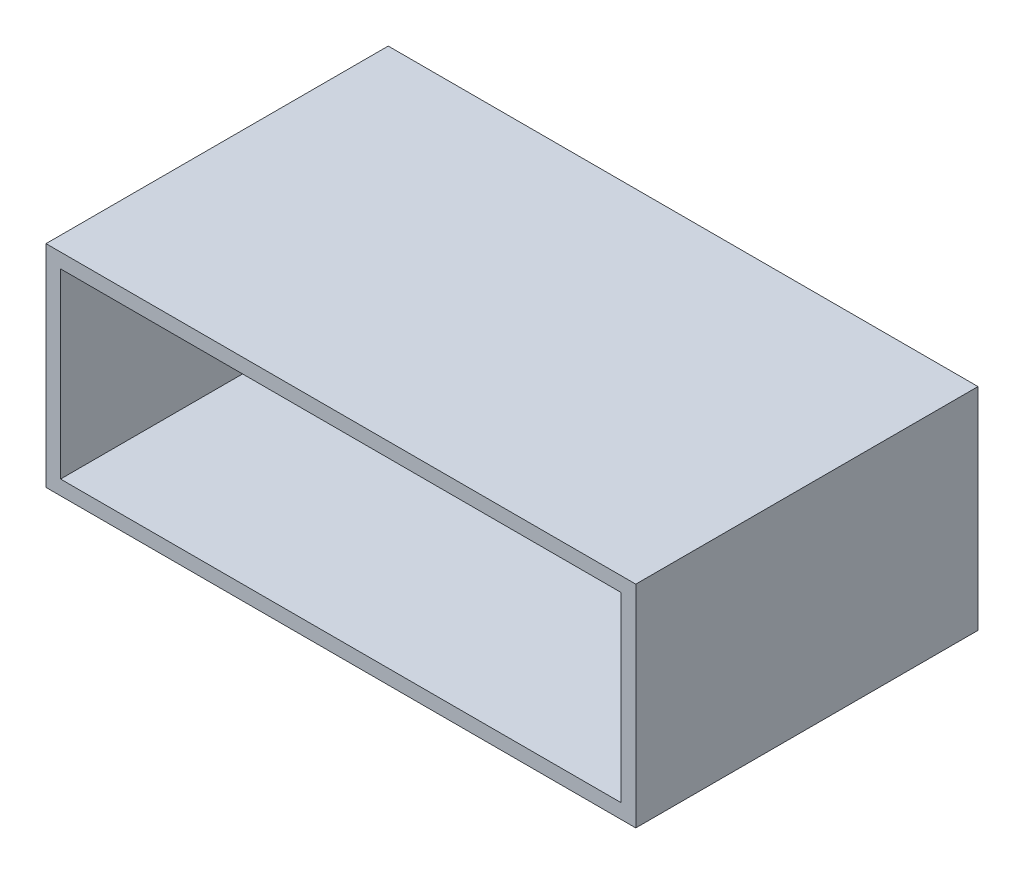
ISO-10303-21;
HEADER;
FILE_DESCRIPTION(('STEP AP214'),'2;1');
FILE_NAME('part.step','',(''),(''),'','','');
FILE_SCHEMA(('AUTOMOTIVE_DESIGN { 1 0 10303 214 1 1 1 1 }'));
ENDSEC;
DATA;
#1=APPLICATION_CONTEXT('core data for automotive mechanical design processes');
#2=APPLICATION_PROTOCOL_DEFINITION('international standard','automotive_design',2000,#1);
#3=PRODUCT_CONTEXT('',#1,'mechanical');
#4=PRODUCT('Part','Part','',(#3));
#5=PRODUCT_RELATED_PRODUCT_CATEGORY('part','',(#4));
#6=PRODUCT_DEFINITION_FORMATION('','',#4);
#7=PRODUCT_DEFINITION_CONTEXT('part definition',#1,'design');
#8=PRODUCT_DEFINITION('design','',#6,#7);
#9=PRODUCT_DEFINITION_SHAPE('','',#8);
#10=(LENGTH_UNIT() NAMED_UNIT(*) SI_UNIT(.MILLI.,.METRE.));
#11=(NAMED_UNIT(*) PLANE_ANGLE_UNIT() SI_UNIT($,.RADIAN.));
#12=(NAMED_UNIT(*) SI_UNIT($,.STERADIAN.) SOLID_ANGLE_UNIT());
#13=UNCERTAINTY_MEASURE_WITH_UNIT(LENGTH_MEASURE(1.E-05),#10,'distance_accuracy_value','');
#14=(GEOMETRIC_REPRESENTATION_CONTEXT(3) GLOBAL_UNCERTAINTY_ASSIGNED_CONTEXT((#13)) GLOBAL_UNIT_ASSIGNED_CONTEXT((#10,
#11,#12)) REPRESENTATION_CONTEXT('',''));
#15=CARTESIAN_POINT('',(0.,0.,0.));
#16=DIRECTION('',(0.,0.,1.));
#17=DIRECTION('',(1.,0.,0.));
#18=AXIS2_PLACEMENT_3D('',#15,#16,#17);
#19=CARTESIAN_POINT('',(0.,0.,47.));
#20=DIRECTION('',(0.,0.,-1.));
#21=DIRECTION('',(-1.,0.,0.));
#22=AXIS2_PLACEMENT_3D('',#19,#20,#21);
#23=PLANE('',#22);
#24=DIRECTION('',(0.,-1.,0.));
#25=VECTOR('',#24,1.);
#26=CARTESIAN_POINT('',(0.,0.,47.));
#27=LINE('',#26,#25);
#28=CARTESIAN_POINT('',(0.,29.,47.));
#29=VERTEX_POINT('',#28);
#30=CARTESIAN_POINT('',(0.,0.,47.));
#31=VERTEX_POINT('',#30);
#32=EDGE_CURVE('E144',#29,#31,#27,.T.);
#33=ORIENTED_EDGE('',*,*,#32,.T.);
#34=DIRECTION('',(1.,0.,0.));
#35=VECTOR('',#34,1.);
#36=CARTESIAN_POINT('',(0.,0.,47.));
#37=LINE('',#36,#35);
#38=CARTESIAN_POINT('',(81.,0.,47.));
#39=VERTEX_POINT('',#38);
#40=EDGE_CURVE('E146',#31,#39,#37,.T.);
#41=ORIENTED_EDGE('',*,*,#40,.T.);
#42=DIRECTION('',(0.,1.,0.));
#43=VECTOR('',#42,1.);
#44=CARTESIAN_POINT('',(81.,0.,47.));
#45=LINE('',#44,#43);
#46=CARTESIAN_POINT('',(81.,29.,47.));
#47=VERTEX_POINT('',#46);
#48=EDGE_CURVE('E151',#39,#47,#45,.T.);
#49=ORIENTED_EDGE('',*,*,#48,.T.);
#50=DIRECTION('',(-1.,0.,0.));
#51=VECTOR('',#50,1.);
#52=CARTESIAN_POINT('',(0.,29.,47.));
#53=LINE('',#52,#51);
#54=EDGE_CURVE('E153',#47,#29,#53,.T.);
#55=ORIENTED_EDGE('',*,*,#54,.T.);
#56=EDGE_LOOP('',(#33,#41,#49,#55));
#57=FACE_BOUND('',#56,.T.);
#58=DIRECTION('',(0.,-1.,0.));
#59=VECTOR('',#58,1.);
#60=CARTESIAN_POINT('',(2.,2.,47.));
#61=LINE('',#60,#59);
#62=CARTESIAN_POINT('',(2.,27.,47.));
#63=VERTEX_POINT('',#62);
#64=CARTESIAN_POINT('',(2.,2.,47.));
#65=VERTEX_POINT('',#64);
#66=EDGE_CURVE('E126',#63,#65,#61,.T.);
#67=ORIENTED_EDGE('',*,*,#66,.F.);
#68=DIRECTION('',(-1.,0.,0.));
#69=VECTOR('',#68,1.);
#70=CARTESIAN_POINT('',(2.,27.,47.));
#71=LINE('',#70,#69);
#72=CARTESIAN_POINT('',(79.,27.,47.));
#73=VERTEX_POINT('',#72);
#74=EDGE_CURVE('E117',#73,#63,#71,.T.);
#75=ORIENTED_EDGE('',*,*,#74,.F.);
#76=DIRECTION('',(0.,1.,0.));
#77=VECTOR('',#76,1.);
#78=CARTESIAN_POINT('',(79.,2.,47.));
#79=LINE('',#78,#77);
#80=CARTESIAN_POINT('',(79.,2.,47.));
#81=VERTEX_POINT('',#80);
#82=EDGE_CURVE('E137',#81,#73,#79,.T.);
#83=ORIENTED_EDGE('',*,*,#82,.F.);
#84=DIRECTION('',(1.,0.,0.));
#85=VECTOR('',#84,1.);
#86=CARTESIAN_POINT('',(2.,2.,47.));
#87=LINE('',#86,#85);
#88=EDGE_CURVE('E128',#65,#81,#87,.T.);
#89=ORIENTED_EDGE('',*,*,#88,.F.);
#90=EDGE_LOOP('',(#67,#75,#83,#89));
#91=FACE_BOUND('',#90,.T.);
#92=ADVANCED_FACE('F43',(#57,#91),#23,.F.);
#93=CARTESIAN_POINT('',(0.,0.,0.));
#94=DIRECTION('',(0.,0.,-1.));
#95=DIRECTION('',(-1.,0.,0.));
#96=AXIS2_PLACEMENT_3D('',#93,#94,#95);
#97=PLANE('',#96);
#98=DIRECTION('',(0.,-1.,0.));
#99=VECTOR('',#98,1.);
#100=CARTESIAN_POINT('',(0.,0.,0.));
#101=LINE('',#100,#99);
#102=CARTESIAN_POINT('',(0.,29.,0.));
#103=VERTEX_POINT('',#102);
#104=CARTESIAN_POINT('',(0.,0.,0.));
#105=VERTEX_POINT('',#104);
#106=EDGE_CURVE('E145',#103,#105,#101,.T.);
#107=ORIENTED_EDGE('',*,*,#106,.F.);
#108=DIRECTION('',(-1.,0.,0.));
#109=VECTOR('',#108,1.);
#110=CARTESIAN_POINT('',(0.,29.,0.));
#111=LINE('',#110,#109);
#112=CARTESIAN_POINT('',(81.,29.,0.));
#113=VERTEX_POINT('',#112);
#114=EDGE_CURVE('E149',#113,#103,#111,.T.);
#115=ORIENTED_EDGE('',*,*,#114,.F.);
#116=DIRECTION('',(0.,1.,0.));
#117=VECTOR('',#116,1.);
#118=CARTESIAN_POINT('',(81.,0.,0.));
#119=LINE('',#118,#117);
#120=CARTESIAN_POINT('',(81.,0.,0.));
#121=VERTEX_POINT('',#120);
#122=EDGE_CURVE('E159',#121,#113,#119,.T.);
#123=ORIENTED_EDGE('',*,*,#122,.F.);
#124=DIRECTION('',(1.,0.,0.));
#125=VECTOR('',#124,1.);
#126=CARTESIAN_POINT('',(0.,0.,0.));
#127=LINE('',#126,#125);
#128=EDGE_CURVE('E158',#105,#121,#127,.T.);
#129=ORIENTED_EDGE('',*,*,#128,.F.);
#130=EDGE_LOOP('',(#107,#115,#123,#129));
#131=FACE_BOUND('',#130,.T.);
#132=ADVANCED_FACE('F180',(#131),#97,.T.);
#133=CARTESIAN_POINT('',(0.,0.,47.));
#134=DIRECTION('',(1.,0.,0.));
#135=DIRECTION('',(0.,0.,-1.));
#136=AXIS2_PLACEMENT_3D('',#133,#134,#135);
#137=PLANE('',#136);
#138=ORIENTED_EDGE('',*,*,#106,.T.);
#139=DIRECTION('',(0.,0.,-1.));
#140=VECTOR('',#139,1.);
#141=CARTESIAN_POINT('',(0.,0.,47.));
#142=LINE('',#141,#140);
#143=EDGE_CURVE('E11',#31,#105,#142,.T.);
#144=ORIENTED_EDGE('',*,*,#143,.F.);
#145=ORIENTED_EDGE('',*,*,#32,.F.);
#146=DIRECTION('',(0.,0.,-1.));
#147=VECTOR('',#146,1.);
#148=CARTESIAN_POINT('',(0.,29.,47.));
#149=LINE('',#148,#147);
#150=EDGE_CURVE('E154',#29,#103,#149,.T.);
#151=ORIENTED_EDGE('',*,*,#150,.T.);
#152=EDGE_LOOP('',(#138,#144,#145,#151));
#153=FACE_BOUND('',#152,.T.);
#154=ADVANCED_FACE('F44',(#153),#137,.F.);
#155=CARTESIAN_POINT('',(0.,0.,47.));
#156=DIRECTION('',(0.,1.,0.));
#157=DIRECTION('',(0.,0.,1.));
#158=AXIS2_PLACEMENT_3D('',#155,#156,#157);
#159=PLANE('',#158);
#160=ORIENTED_EDGE('',*,*,#128,.T.);
#161=DIRECTION('',(0.,0.,-1.));
#162=VECTOR('',#161,1.);
#163=CARTESIAN_POINT('',(81.,0.,47.));
#164=LINE('',#163,#162);
#165=EDGE_CURVE('E51',#39,#121,#164,.T.);
#166=ORIENTED_EDGE('',*,*,#165,.F.);
#167=ORIENTED_EDGE('',*,*,#40,.F.);
#168=ORIENTED_EDGE('',*,*,#143,.T.);
#169=EDGE_LOOP('',(#160,#166,#167,#168));
#170=FACE_BOUND('',#169,.T.);
#171=ADVANCED_FACE('F189',(#170),#159,.F.);
#172=CARTESIAN_POINT('',(81.,0.,47.));
#173=DIRECTION('',(-1.,0.,0.));
#174=DIRECTION('',(0.,0.,1.));
#175=AXIS2_PLACEMENT_3D('',#172,#173,#174);
#176=PLANE('',#175);
#177=ORIENTED_EDGE('',*,*,#122,.T.);
#178=DIRECTION('',(0.,0.,-1.));
#179=VECTOR('',#178,1.);
#180=CARTESIAN_POINT('',(81.,29.,47.));
#181=LINE('',#180,#179);
#182=EDGE_CURVE('E164',#47,#113,#181,.T.);
#183=ORIENTED_EDGE('',*,*,#182,.F.);
#184=ORIENTED_EDGE('',*,*,#48,.F.);
#185=ORIENTED_EDGE('',*,*,#165,.T.);
#186=EDGE_LOOP('',(#177,#183,#184,#185));
#187=FACE_BOUND('',#186,.T.);
#188=ADVANCED_FACE('F175',(#187),#176,.F.);
#189=CARTESIAN_POINT('',(0.,29.,47.));
#190=DIRECTION('',(0.,-1.,0.));
#191=DIRECTION('',(0.,0.,-1.));
#192=AXIS2_PLACEMENT_3D('',#189,#190,#191);
#193=PLANE('',#192);
#194=ORIENTED_EDGE('',*,*,#114,.T.);
#195=ORIENTED_EDGE('',*,*,#150,.F.);
#196=ORIENTED_EDGE('',*,*,#54,.F.);
#197=ORIENTED_EDGE('',*,*,#182,.T.);
#198=EDGE_LOOP('',(#194,#195,#196,#197));
#199=FACE_BOUND('',#198,.T.);
#200=ADVANCED_FACE('F182',(#199),#193,.F.);
#201=CARTESIAN_POINT('',(2.,2.,47.));
#202=DIRECTION('',(1.,0.,0.));
#203=DIRECTION('',(0.,0.,-1.));
#204=AXIS2_PLACEMENT_3D('',#201,#202,#203);
#205=PLANE('',#204);
#206=DIRECTION('',(0.,-1.,0.));
#207=VECTOR('',#206,1.);
#208=CARTESIAN_POINT('',(2.,2.,2.));
#209=LINE('',#208,#207);
#210=CARTESIAN_POINT('',(2.,27.,2.));
#211=VERTEX_POINT('',#210);
#212=CARTESIAN_POINT('',(2.,2.,2.));
#213=VERTEX_POINT('',#212);
#214=EDGE_CURVE('E124',#211,#213,#209,.T.);
#215=ORIENTED_EDGE('',*,*,#214,.F.);
#216=DIRECTION('',(0.,0.,-1.));
#217=VECTOR('',#216,1.);
#218=CARTESIAN_POINT('',(2.,27.,47.));
#219=LINE('',#218,#217);
#220=EDGE_CURVE('E109',#63,#211,#219,.T.);
#221=ORIENTED_EDGE('',*,*,#220,.F.);
#222=ORIENTED_EDGE('',*,*,#66,.T.);
#223=DIRECTION('',(0.,0.,-1.));
#224=VECTOR('',#223,1.);
#225=CARTESIAN_POINT('',(2.,2.,47.));
#226=LINE('',#225,#224);
#227=EDGE_CURVE('E121',#65,#213,#226,.T.);
#228=ORIENTED_EDGE('',*,*,#227,.T.);
#229=EDGE_LOOP('',(#215,#221,#222,#228));
#230=FACE_BOUND('',#229,.T.);
#231=ADVANCED_FACE('F125',(#230),#205,.T.);
#232=CARTESIAN_POINT('',(2.,2.,47.));
#233=DIRECTION('',(0.,1.,0.));
#234=DIRECTION('',(0.,0.,1.));
#235=AXIS2_PLACEMENT_3D('',#232,#233,#234);
#236=PLANE('',#235);
#237=DIRECTION('',(1.,0.,0.));
#238=VECTOR('',#237,1.);
#239=CARTESIAN_POINT('',(2.,2.,2.));
#240=LINE('',#239,#238);
#241=CARTESIAN_POINT('',(79.,2.,2.));
#242=VERTEX_POINT('',#241);
#243=EDGE_CURVE('E59',#213,#242,#240,.T.);
#244=ORIENTED_EDGE('',*,*,#243,.F.);
#245=ORIENTED_EDGE('',*,*,#227,.F.);
#246=ORIENTED_EDGE('',*,*,#88,.T.);
#247=DIRECTION('',(0.,0.,-1.));
#248=VECTOR('',#247,1.);
#249=CARTESIAN_POINT('',(79.,2.,47.));
#250=LINE('',#249,#248);
#251=EDGE_CURVE('E143',#81,#242,#250,.T.);
#252=ORIENTED_EDGE('',*,*,#251,.T.);
#253=EDGE_LOOP('',(#244,#245,#246,#252));
#254=FACE_BOUND('',#253,.T.);
#255=ADVANCED_FACE('F208',(#254),#236,.T.);
#256=CARTESIAN_POINT('',(79.,2.,47.));
#257=DIRECTION('',(-1.,0.,0.));
#258=DIRECTION('',(0.,0.,1.));
#259=AXIS2_PLACEMENT_3D('',#256,#257,#258);
#260=PLANE('',#259);
#261=DIRECTION('',(0.,1.,0.));
#262=VECTOR('',#261,1.);
#263=CARTESIAN_POINT('',(79.,2.,2.));
#264=LINE('',#263,#262);
#265=CARTESIAN_POINT('',(79.,27.,2.));
#266=VERTEX_POINT('',#265);
#267=EDGE_CURVE('E67',#242,#266,#264,.T.);
#268=ORIENTED_EDGE('',*,*,#267,.F.);
#269=ORIENTED_EDGE('',*,*,#251,.F.);
#270=ORIENTED_EDGE('',*,*,#82,.T.);
#271=DIRECTION('',(0.,0.,-1.));
#272=VECTOR('',#271,1.);
#273=CARTESIAN_POINT('',(79.,27.,47.));
#274=LINE('',#273,#272);
#275=EDGE_CURVE('E116',#73,#266,#274,.T.);
#276=ORIENTED_EDGE('',*,*,#275,.T.);
#277=EDGE_LOOP('',(#268,#269,#270,#276));
#278=FACE_BOUND('',#277,.T.);
#279=ADVANCED_FACE('F215',(#278),#260,.T.);
#280=CARTESIAN_POINT('',(2.,27.,47.));
#281=DIRECTION('',(0.,-1.,0.));
#282=DIRECTION('',(0.,0.,-1.));
#283=AXIS2_PLACEMENT_3D('',#280,#281,#282);
#284=PLANE('',#283);
#285=DIRECTION('',(-1.,0.,0.));
#286=VECTOR('',#285,1.);
#287=CARTESIAN_POINT('',(2.,27.,2.));
#288=LINE('',#287,#286);
#289=EDGE_CURVE('E111',#266,#211,#288,.T.);
#290=ORIENTED_EDGE('',*,*,#289,.F.);
#291=ORIENTED_EDGE('',*,*,#275,.F.);
#292=ORIENTED_EDGE('',*,*,#74,.T.);
#293=ORIENTED_EDGE('',*,*,#220,.T.);
#294=EDGE_LOOP('',(#290,#291,#292,#293));
#295=FACE_BOUND('',#294,.T.);
#296=ADVANCED_FACE('F115',(#295),#284,.T.);
#297=CARTESIAN_POINT('',(0.,0.,2.));
#298=DIRECTION('',(0.,0.,-1.));
#299=DIRECTION('',(-1.,0.,0.));
#300=AXIS2_PLACEMENT_3D('',#297,#298,#299);
#301=PLANE('',#300);
#302=ORIENTED_EDGE('',*,*,#214,.T.);
#303=ORIENTED_EDGE('',*,*,#243,.T.);
#304=ORIENTED_EDGE('',*,*,#267,.T.);
#305=ORIENTED_EDGE('',*,*,#289,.T.);
#306=EDGE_LOOP('',(#302,#303,#304,#305));
#307=FACE_BOUND('',#306,.T.);
#308=ADVANCED_FACE('F130',(#307),#301,.F.);
#309=CLOSED_SHELL('',(#92,#132,#154,#171,#188,#200,#231,#255,#279,#296,#308));
#310=MANIFOLD_SOLID_BREP('B2',#309);
#311=ADVANCED_BREP_SHAPE_REPRESENTATION('',(#18,#310),#14);
#312=SHAPE_DEFINITION_REPRESENTATION(#9,#311);
ENDSEC;
END-ISO-10303-21;
